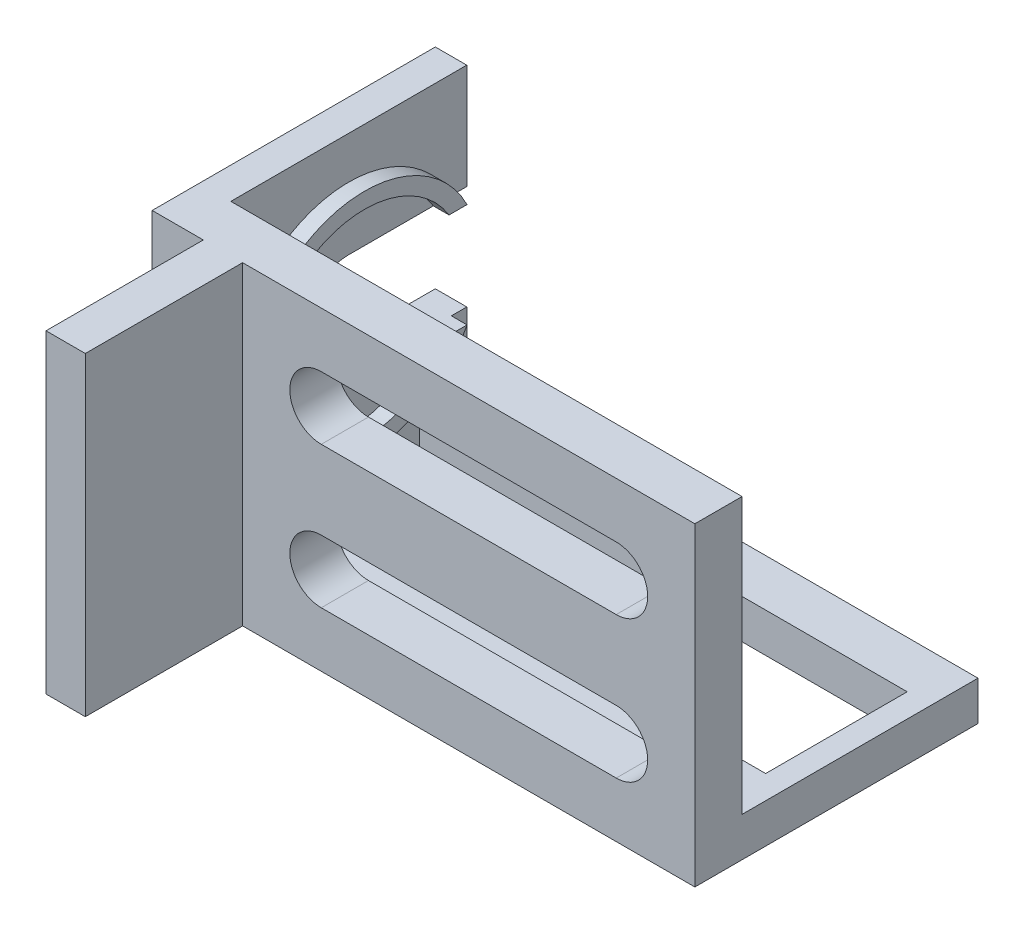
ISO-10303-21;
HEADER;
FILE_DESCRIPTION(('STEP AP214'),'2;1');
FILE_NAME('part.step','',(''),(''),'','','');
FILE_SCHEMA(('AUTOMOTIVE_DESIGN { 1 0 10303 214 1 1 1 1 }'));
ENDSEC;
DATA;
#1=APPLICATION_CONTEXT('core data for automotive mechanical design processes');
#2=APPLICATION_PROTOCOL_DEFINITION('international standard','automotive_design',2000,#1);
#3=PRODUCT_CONTEXT('',#1,'mechanical');
#4=PRODUCT('Part','Part','',(#3));
#5=PRODUCT_RELATED_PRODUCT_CATEGORY('part','',(#4));
#6=PRODUCT_DEFINITION_FORMATION('','',#4);
#7=PRODUCT_DEFINITION_CONTEXT('part definition',#1,'design');
#8=PRODUCT_DEFINITION('design','',#6,#7);
#9=PRODUCT_DEFINITION_SHAPE('','',#8);
#10=(LENGTH_UNIT() NAMED_UNIT(*) SI_UNIT(.MILLI.,.METRE.));
#11=(NAMED_UNIT(*) PLANE_ANGLE_UNIT() SI_UNIT($,.RADIAN.));
#12=(NAMED_UNIT(*) SI_UNIT($,.STERADIAN.) SOLID_ANGLE_UNIT());
#13=UNCERTAINTY_MEASURE_WITH_UNIT(LENGTH_MEASURE(1.E-05),#10,'distance_accuracy_value','');
#14=(GEOMETRIC_REPRESENTATION_CONTEXT(3) GLOBAL_UNCERTAINTY_ASSIGNED_CONTEXT((#13)) GLOBAL_UNIT_ASSIGNED_CONTEXT((#10,
#11,#12)) REPRESENTATION_CONTEXT('',''));
#15=CARTESIAN_POINT('',(0.,0.,0.));
#16=DIRECTION('',(0.,0.,1.));
#17=DIRECTION('',(1.,0.,0.));
#18=AXIS2_PLACEMENT_3D('',#15,#16,#17);
#19=CARTESIAN_POINT('',(40.3102496759067,-20.,-6.));
#20=DIRECTION('',(0.,0.,1.));
#21=DIRECTION('',(1.,0.,0.));
#22=AXIS2_PLACEMENT_3D('',#19,#20,#21);
#23=PLANE('',#22);
#24=DIRECTION('',(0.,-1.,0.));
#25=VECTOR('',#24,1.);
#26=CARTESIAN_POINT('',(29.5,-20.,-6.));
#27=LINE('',#26,#25);
#28=CARTESIAN_POINT('',(29.5,-15.,-6.));
#29=VERTEX_POINT('',#28);
#30=CARTESIAN_POINT('',(29.5,-20.,-6.));
#31=VERTEX_POINT('',#30);
#32=EDGE_CURVE('E857',#29,#31,#27,.T.);
#33=ORIENTED_EDGE('',*,*,#32,.T.);
#34=DIRECTION('',(-1.,0.,0.));
#35=VECTOR('',#34,1.);
#36=CARTESIAN_POINT('',(40.3102496759067,-20.,-6.));
#37=LINE('',#36,#35);
#38=CARTESIAN_POINT('',(-32.5,-20.,-6.));
#39=VERTEX_POINT('',#38);
#40=EDGE_CURVE('E886',#31,#39,#37,.T.);
#41=ORIENTED_EDGE('',*,*,#40,.T.);
#42=DIRECTION('',(0.,1.,0.));
#43=VECTOR('',#42,1.);
#44=CARTESIAN_POINT('',(-32.5,-20.,-6.));
#45=LINE('',#44,#43);
#46=CARTESIAN_POINT('',(-32.5,-15.,-6.));
#47=VERTEX_POINT('',#46);
#48=EDGE_CURVE('E873',#39,#47,#45,.T.);
#49=ORIENTED_EDGE('',*,*,#48,.T.);
#50=DIRECTION('',(-1.,0.,0.));
#51=VECTOR('',#50,1.);
#52=CARTESIAN_POINT('',(40.3102496759067,-15.,-6.));
#53=LINE('',#52,#51);
#54=EDGE_CURVE('E50',#29,#47,#53,.T.);
#55=ORIENTED_EDGE('',*,*,#54,.F.);
#56=EDGE_LOOP('',(#33,#41,#49,#55));
#57=FACE_BOUND('',#56,.T.);
#58=ADVANCED_FACE('F35',(#57),#23,.F.);
#59=CARTESIAN_POINT('',(40.3102496759067,-20.,-24.));
#60=DIRECTION('',(0.,0.,-1.));
#61=DIRECTION('',(-1.,0.,0.));
#62=AXIS2_PLACEMENT_3D('',#59,#60,#61);
#63=PLANE('',#62);
#64=DIRECTION('',(0.,-1.,0.));
#65=VECTOR('',#64,1.);
#66=CARTESIAN_POINT('',(29.5,-20.,-24.));
#67=LINE('',#66,#65);
#68=CARTESIAN_POINT('',(29.5,-15.,-24.));
#69=VERTEX_POINT('',#68);
#70=CARTESIAN_POINT('',(29.5,-20.,-24.));
#71=VERTEX_POINT('',#70);
#72=EDGE_CURVE('E866',#69,#71,#67,.T.);
#73=ORIENTED_EDGE('',*,*,#72,.F.);
#74=DIRECTION('',(-1.,0.,0.));
#75=VECTOR('',#74,1.);
#76=CARTESIAN_POINT('',(40.3102496759067,-15.,-24.));
#77=LINE('',#76,#75);
#78=CARTESIAN_POINT('',(-32.5,-15.,-24.));
#79=VERTEX_POINT('',#78);
#80=EDGE_CURVE('E865',#69,#79,#77,.T.);
#81=ORIENTED_EDGE('',*,*,#80,.T.);
#82=DIRECTION('',(0.,-1.,0.));
#83=VECTOR('',#82,1.);
#84=CARTESIAN_POINT('',(-32.5,-20.,-24.));
#85=LINE('',#84,#83);
#86=CARTESIAN_POINT('',(-32.5,-20.,-24.));
#87=VERTEX_POINT('',#86);
#88=EDGE_CURVE('E876',#79,#87,#85,.T.);
#89=ORIENTED_EDGE('',*,*,#88,.T.);
#90=DIRECTION('',(-1.,0.,0.));
#91=VECTOR('',#90,1.);
#92=CARTESIAN_POINT('',(40.3102496759067,-20.,-24.));
#93=LINE('',#92,#91);
#94=EDGE_CURVE('E58',#71,#87,#93,.T.);
#95=ORIENTED_EDGE('',*,*,#94,.F.);
#96=EDGE_LOOP('',(#73,#81,#89,#95));
#97=FACE_BOUND('',#96,.T.);
#98=ADVANCED_FACE('F506',(#97),#63,.F.);
#99=CARTESIAN_POINT('',(-32.5,0.,0.));
#100=DIRECTION('',(-1.,0.,0.));
#101=DIRECTION('',(0.,0.,1.));
#102=AXIS2_PLACEMENT_3D('',#99,#100,#101);
#103=PLANE('',#102);
#104=ORIENTED_EDGE('',*,*,#88,.F.);
#105=DIRECTION('',(0.,0.,1.));
#106=VECTOR('',#105,1.);
#107=CARTESIAN_POINT('',(-32.5,-15.,-30.));
#108=LINE('',#107,#106);
#109=CARTESIAN_POINT('',(-32.5,-15.,-30.));
#110=VERTEX_POINT('',#109);
#111=EDGE_CURVE('E861',#110,#79,#108,.T.);
#112=ORIENTED_EDGE('',*,*,#111,.F.);
#113=DIRECTION('',(0.,-1.,0.));
#114=VECTOR('',#113,1.);
#115=CARTESIAN_POINT('',(-32.5,20.,-30.));
#116=LINE('',#115,#114);
#117=CARTESIAN_POINT('',(-32.5,-6.62500000000001,-30.));
#118=VERTEX_POINT('',#117);
#119=EDGE_CURVE('E284',#118,#110,#116,.T.);
#120=ORIENTED_EDGE('',*,*,#119,.F.);
#121=DIRECTION('',(0.,0.,-1.));
#122=VECTOR('',#121,1.);
#123=CARTESIAN_POINT('',(-32.5,-6.62500000000001,-15.));
#124=LINE('',#123,#122);
#125=CARTESIAN_POINT('',(-32.5,-6.62500000000001,-28.0384048104053));
#126=VERTEX_POINT('',#125);
#127=EDGE_CURVE('E246',#126,#118,#124,.T.);
#128=ORIENTED_EDGE('',*,*,#127,.F.);
#129=CARTESIAN_POINT('',(-32.5,0.,-15.));
#130=DIRECTION('',(1.,0.,0.));
#131=DIRECTION('',(0.,0.,-1.));
#132=AXIS2_PLACEMENT_3D('',#129,#130,#131);
#133=CIRCLE('',#132,14.625);
#134=CARTESIAN_POINT('',(-32.5,6.62500000000001,-28.0384048104053));
#135=VERTEX_POINT('',#134);
#136=EDGE_CURVE('E387',#135,#126,#133,.T.);
#137=ORIENTED_EDGE('',*,*,#136,.F.);
#138=DIRECTION('',(0.,0.,1.));
#139=VECTOR('',#138,1.);
#140=CARTESIAN_POINT('',(-32.5,6.62500000000001,-30.));
#141=LINE('',#140,#139);
#142=CARTESIAN_POINT('',(-32.5,6.62500000000001,-30.));
#143=VERTEX_POINT('',#142);
#144=EDGE_CURVE('E411',#143,#135,#141,.T.);
#145=ORIENTED_EDGE('',*,*,#144,.F.);
#146=CARTESIAN_POINT('',(-32.5,20.,-30.));
#147=VERTEX_POINT('',#146);
#148=EDGE_CURVE('E286',#147,#143,#116,.T.);
#149=ORIENTED_EDGE('',*,*,#148,.F.);
#150=DIRECTION('',(0.,0.,-1.));
#151=VECTOR('',#150,1.);
#152=CARTESIAN_POINT('',(-32.5,20.,0.));
#153=LINE('',#152,#151);
#154=CARTESIAN_POINT('',(-32.5,20.,0.));
#155=VERTEX_POINT('',#154);
#156=EDGE_CURVE('E282',#155,#147,#153,.T.);
#157=ORIENTED_EDGE('',*,*,#156,.F.);
#158=DIRECTION('',(0.,-1.,0.));
#159=VECTOR('',#158,1.);
#160=CARTESIAN_POINT('',(-32.5,-20.,0.));
#161=LINE('',#160,#159);
#162=CARTESIAN_POINT('',(-32.5,-15.,0.));
#163=VERTEX_POINT('',#162);
#164=EDGE_CURVE('E295',#155,#163,#161,.T.);
#165=ORIENTED_EDGE('',*,*,#164,.T.);
#166=DIRECTION('',(0.,0.,1.));
#167=VECTOR('',#166,1.);
#168=CARTESIAN_POINT('',(-32.5,-15.,0.));
#169=LINE('',#168,#167);
#170=EDGE_CURVE('E882',#47,#163,#169,.T.);
#171=ORIENTED_EDGE('',*,*,#170,.F.);
#172=ORIENTED_EDGE('',*,*,#48,.F.);
#173=DIRECTION('',(0.,0.,1.));
#174=VECTOR('',#173,1.);
#175=CARTESIAN_POINT('',(-32.5,-20.,0.));
#176=LINE('',#175,#174);
#177=EDGE_CURVE('E274',#87,#39,#176,.T.);
#178=ORIENTED_EDGE('',*,*,#177,.F.);
#179=EDGE_LOOP('',(#104,#112,#120,#128,#137,#145,#149,#157,#165,#171,#172,#178));
#180=FACE_BOUND('',#179,.T.);
#181=ADVANCED_FACE('F474',(#180),#103,.F.);
#182=CARTESIAN_POINT('',(0.,0.,0.));
#183=DIRECTION('',(0.,0.,1.));
#184=DIRECTION('',(1.,0.,0.));
#185=AXIS2_PLACEMENT_3D('',#182,#183,#184);
#186=PLANE('',#185);
#187=DIRECTION('',(-1.,0.,0.));
#188=VECTOR('',#187,1.);
#189=CARTESIAN_POINT('',(0.,-5.00000000000001,0.));
#190=LINE('',#189,#188);
#191=CARTESIAN_POINT('',(22.5,-5.,0.));
#192=VERTEX_POINT('',#191);
#193=CARTESIAN_POINT('',(-15.,-5.00000000000001,0.));
#194=VERTEX_POINT('',#193);
#195=EDGE_CURVE('E321',#192,#194,#190,.T.);
#196=ORIENTED_EDGE('',*,*,#195,.T.);
#197=CARTESIAN_POINT('',(-15.,-9.00000000000001,0.));
#198=DIRECTION('',(0.,0.,1.));
#199=DIRECTION('',(1.,0.,0.));
#200=AXIS2_PLACEMENT_3D('',#197,#198,#199);
#201=CIRCLE('',#200,4.);
#202=CARTESIAN_POINT('',(-15.,-13.,0.));
#203=VERTEX_POINT('',#202);
#204=EDGE_CURVE('E324',#194,#203,#201,.T.);
#205=ORIENTED_EDGE('',*,*,#204,.T.);
#206=DIRECTION('',(1.,0.,0.));
#207=VECTOR('',#206,1.);
#208=CARTESIAN_POINT('',(0.,-13.,0.));
#209=LINE('',#208,#207);
#210=CARTESIAN_POINT('',(22.5,-13.,0.));
#211=VERTEX_POINT('',#210);
#212=EDGE_CURVE('E315',#203,#211,#209,.T.);
#213=ORIENTED_EDGE('',*,*,#212,.T.);
#214=CARTESIAN_POINT('',(22.5,-9.,0.));
#215=DIRECTION('',(0.,0.,1.));
#216=DIRECTION('',(1.,0.,0.));
#217=AXIS2_PLACEMENT_3D('',#214,#215,#216);
#218=CIRCLE('',#217,4.);
#219=EDGE_CURVE('E318',#211,#192,#218,.T.);
#220=ORIENTED_EDGE('',*,*,#219,.T.);
#221=EDGE_LOOP('',(#196,#205,#213,#220));
#222=FACE_BOUND('',#221,.T.);
#223=DIRECTION('',(-1.,0.,0.));
#224=VECTOR('',#223,1.);
#225=CARTESIAN_POINT('',(0.,13.,0.));
#226=LINE('',#225,#224);
#227=CARTESIAN_POINT('',(22.5,13.,0.));
#228=VERTEX_POINT('',#227);
#229=CARTESIAN_POINT('',(-15.,13.,0.));
#230=VERTEX_POINT('',#229);
#231=EDGE_CURVE('E43',#228,#230,#226,.T.);
#232=ORIENTED_EDGE('',*,*,#231,.T.);
#233=CARTESIAN_POINT('',(-15.,8.99999999999999,0.));
#234=DIRECTION('',(0.,0.,1.));
#235=DIRECTION('',(1.,0.,0.));
#236=AXIS2_PLACEMENT_3D('',#233,#234,#235);
#237=CIRCLE('',#236,4.);
#238=CARTESIAN_POINT('',(-15.,4.99999999999999,0.));
#239=VERTEX_POINT('',#238);
#240=EDGE_CURVE('E11',#230,#239,#237,.T.);
#241=ORIENTED_EDGE('',*,*,#240,.T.);
#242=DIRECTION('',(1.,0.,0.));
#243=VECTOR('',#242,1.);
#244=CARTESIAN_POINT('',(0.,4.99999999999999,0.));
#245=LINE('',#244,#243);
#246=CARTESIAN_POINT('',(22.5,5.,0.));
#247=VERTEX_POINT('',#246);
#248=EDGE_CURVE('E327',#239,#247,#245,.T.);
#249=ORIENTED_EDGE('',*,*,#248,.T.);
#250=CARTESIAN_POINT('',(22.5,8.99999999999999,0.));
#251=DIRECTION('',(0.,0.,1.));
#252=DIRECTION('',(1.,0.,0.));
#253=AXIS2_PLACEMENT_3D('',#250,#251,#252);
#254=CIRCLE('',#253,4.);
#255=EDGE_CURVE('E330',#247,#228,#254,.T.);
#256=ORIENTED_EDGE('',*,*,#255,.T.);
#257=EDGE_LOOP('',(#232,#241,#249,#256));
#258=FACE_BOUND('',#257,.T.);
#259=DIRECTION('',(-1.,0.,0.));
#260=VECTOR('',#259,1.);
#261=CARTESIAN_POINT('',(40.3102496759067,-15.,0.));
#262=LINE('',#261,#260);
#263=CARTESIAN_POINT('',(32.5,-15.,0.));
#264=VERTEX_POINT('',#263);
#265=EDGE_CURVE('E469',#264,#163,#262,.T.);
#266=ORIENTED_EDGE('',*,*,#265,.T.);
#267=ORIENTED_EDGE('',*,*,#164,.F.);
#268=DIRECTION('',(-1.,0.,0.));
#269=VECTOR('',#268,1.);
#270=CARTESIAN_POINT('',(32.5,20.,0.));
#271=LINE('',#270,#269);
#272=CARTESIAN_POINT('',(32.5,20.,0.));
#273=VERTEX_POINT('',#272);
#274=EDGE_CURVE('E309',#273,#155,#271,.T.);
#275=ORIENTED_EDGE('',*,*,#274,.F.);
#276=DIRECTION('',(0.,1.,0.));
#277=VECTOR('',#276,1.);
#278=CARTESIAN_POINT('',(32.5,-20.,0.));
#279=LINE('',#278,#277);
#280=EDGE_CURVE('E307',#264,#273,#279,.T.);
#281=ORIENTED_EDGE('',*,*,#280,.F.);
#282=EDGE_LOOP('',(#266,#267,#275,#281));
#283=FACE_BOUND('',#282,.T.);
#284=ADVANCED_FACE('F334',(#222,#258,#283),#186,.F.);
#285=CARTESIAN_POINT('',(-32.5,0.,-15.));
#286=DIRECTION('',(-1.,0.,0.));
#287=DIRECTION('',(0.,0.,-1.));
#288=AXIS2_PLACEMENT_3D('',#285,#286,#287);
#289=CIRCLE('',#288,12.625);
#290=CARTESIAN_POINT('',(-32.5,-6.62500000000001,-25.7470926301023));
#291=VERTEX_POINT('',#290);
#292=CARTESIAN_POINT('',(-32.5,6.62500000000001,-25.7470926301023));
#293=VERTEX_POINT('',#292);
#294=EDGE_CURVE('E352',#291,#293,#289,.T.);
#295=ORIENTED_EDGE('',*,*,#294,.F.);
#296=CARTESIAN_POINT('',(-32.5,-6.62500000000001,-15.));
#297=VERTEX_POINT('',#296);
#298=EDGE_CURVE('E408',#297,#291,#124,.T.);
#299=ORIENTED_EDGE('',*,*,#298,.F.);
#300=CARTESIAN_POINT('',(-32.5,0.,-15.));
#301=DIRECTION('',(1.,0.,0.));
#302=DIRECTION('',(0.,0.,-1.));
#303=AXIS2_PLACEMENT_3D('',#300,#301,#302);
#304=CIRCLE('',#303,6.62500000000001);
#305=CARTESIAN_POINT('',(-32.5,6.62500000000001,-15.));
#306=VERTEX_POINT('',#305);
#307=EDGE_CURVE('E405',#306,#297,#304,.T.);
#308=ORIENTED_EDGE('',*,*,#307,.F.);
#309=EDGE_CURVE('E410',#293,#306,#141,.T.);
#310=ORIENTED_EDGE('',*,*,#309,.F.);
#311=EDGE_LOOP('',(#295,#299,#308,#310));
#312=FACE_BOUND('',#311,.T.);
#313=ADVANCED_FACE('F503',(#312),#103,.F.);
#314=CARTESIAN_POINT('',(0.,0.,6.));
#315=DIRECTION('',(0.,0.,1.));
#316=DIRECTION('',(1.,0.,0.));
#317=AXIS2_PLACEMENT_3D('',#314,#315,#316);
#318=PLANE('',#317);
#319=CARTESIAN_POINT('',(-15.,8.99999999999999,6.));
#320=DIRECTION('',(0.,0.,1.));
#321=DIRECTION('',(1.,0.,0.));
#322=AXIS2_PLACEMENT_3D('',#319,#320,#321);
#323=CIRCLE('',#322,4.);
#324=CARTESIAN_POINT('',(-15.,13.,6.));
#325=VERTEX_POINT('',#324);
#326=CARTESIAN_POINT('',(-15.,4.99999999999999,6.));
#327=VERTEX_POINT('',#326);
#328=EDGE_CURVE('E376',#325,#327,#323,.T.);
#329=ORIENTED_EDGE('',*,*,#328,.F.);
#330=DIRECTION('',(-1.,0.,0.));
#331=VECTOR('',#330,1.);
#332=CARTESIAN_POINT('',(-15.,13.,6.));
#333=LINE('',#332,#331);
#334=CARTESIAN_POINT('',(22.5,13.,6.));
#335=VERTEX_POINT('',#334);
#336=EDGE_CURVE('E360',#335,#325,#333,.T.);
#337=ORIENTED_EDGE('',*,*,#336,.F.);
#338=CARTESIAN_POINT('',(22.5,8.99999999999999,6.));
#339=DIRECTION('',(0.,0.,1.));
#340=DIRECTION('',(1.,0.,0.));
#341=AXIS2_PLACEMENT_3D('',#338,#339,#340);
#342=CIRCLE('',#341,4.);
#343=CARTESIAN_POINT('',(22.5,4.99999999999999,6.));
#344=VERTEX_POINT('',#343);
#345=EDGE_CURVE('E348',#344,#335,#342,.T.);
#346=ORIENTED_EDGE('',*,*,#345,.F.);
#347=DIRECTION('',(1.,0.,0.));
#348=VECTOR('',#347,1.);
#349=CARTESIAN_POINT('',(-15.,4.99999999999999,6.));
#350=LINE('',#349,#348);
#351=EDGE_CURVE('E890',#327,#344,#350,.T.);
#352=ORIENTED_EDGE('',*,*,#351,.F.);
#353=EDGE_LOOP('',(#329,#337,#346,#352));
#354=FACE_BOUND('',#353,.T.);
#355=CARTESIAN_POINT('',(-15.,-9.00000000000001,6.));
#356=DIRECTION('',(0.,0.,1.));
#357=DIRECTION('',(1.,0.,0.));
#358=AXIS2_PLACEMENT_3D('',#355,#356,#357);
#359=CIRCLE('',#358,4.);
#360=CARTESIAN_POINT('',(-15.,-5.00000000000001,6.));
#361=VERTEX_POINT('',#360);
#362=CARTESIAN_POINT('',(-15.,-13.,6.));
#363=VERTEX_POINT('',#362);
#364=EDGE_CURVE('E361',#361,#363,#359,.T.);
#365=ORIENTED_EDGE('',*,*,#364,.F.);
#366=DIRECTION('',(-1.,0.,0.));
#367=VECTOR('',#366,1.);
#368=CARTESIAN_POINT('',(-15.,-5.00000000000001,6.));
#369=LINE('',#368,#367);
#370=CARTESIAN_POINT('',(22.5,-5.,6.));
#371=VERTEX_POINT('',#370);
#372=EDGE_CURVE('E370',#371,#361,#369,.T.);
#373=ORIENTED_EDGE('',*,*,#372,.F.);
#374=CARTESIAN_POINT('',(22.5,-9.,6.));
#375=DIRECTION('',(0.,0.,1.));
#376=DIRECTION('',(1.,0.,0.));
#377=AXIS2_PLACEMENT_3D('',#374,#375,#376);
#378=CIRCLE('',#377,4.);
#379=CARTESIAN_POINT('',(22.5,-13.,6.));
#380=VERTEX_POINT('',#379);
#381=EDGE_CURVE('E367',#380,#371,#378,.T.);
#382=ORIENTED_EDGE('',*,*,#381,.F.);
#383=DIRECTION('',(1.,0.,0.));
#384=VECTOR('',#383,1.);
#385=CARTESIAN_POINT('',(-15.,-13.,6.));
#386=LINE('',#385,#384);
#387=EDGE_CURVE('E363',#363,#380,#386,.T.);
#388=ORIENTED_EDGE('',*,*,#387,.F.);
#389=EDGE_LOOP('',(#365,#373,#382,#388));
#390=FACE_BOUND('',#389,.T.);
#391=DIRECTION('',(-1.,0.,0.));
#392=VECTOR('',#391,1.);
#393=CARTESIAN_POINT('',(32.5,20.,6.));
#394=LINE('',#393,#392);
#395=CARTESIAN_POINT('',(32.5,20.,6.));
#396=VERTEX_POINT('',#395);
#397=CARTESIAN_POINT('',(-25.,20.,6.));
#398=VERTEX_POINT('',#397);
#399=EDGE_CURVE('E302',#396,#398,#394,.T.);
#400=ORIENTED_EDGE('',*,*,#399,.T.);
#401=DIRECTION('',(0.,-1.,0.));
#402=VECTOR('',#401,1.);
#403=CARTESIAN_POINT('',(-25.,0.,6.));
#404=LINE('',#403,#402);
#405=CARTESIAN_POINT('',(-25.,-20.,6.));
#406=VERTEX_POINT('',#405);
#407=EDGE_CURVE('E417',#398,#406,#404,.T.);
#408=ORIENTED_EDGE('',*,*,#407,.T.);
#409=DIRECTION('',(1.,0.,0.));
#410=VECTOR('',#409,1.);
#411=CARTESIAN_POINT('',(32.5,-20.,6.));
#412=LINE('',#411,#410);
#413=CARTESIAN_POINT('',(32.5,-20.,6.));
#414=VERTEX_POINT('',#413);
#415=EDGE_CURVE('E299',#406,#414,#412,.T.);
#416=ORIENTED_EDGE('',*,*,#415,.T.);
#417=DIRECTION('',(0.,1.,0.));
#418=VECTOR('',#417,1.);
#419=CARTESIAN_POINT('',(32.5,-20.,6.));
#420=LINE('',#419,#418);
#421=EDGE_CURVE('E298',#414,#396,#420,.T.);
#422=ORIENTED_EDGE('',*,*,#421,.T.);
#423=EDGE_LOOP('',(#400,#408,#416,#422));
#424=FACE_BOUND('',#423,.T.);
#425=ADVANCED_FACE('F454',(#354,#390,#424),#318,.T.);
#426=CARTESIAN_POINT('',(-36.5,20.,-30.));
#427=DIRECTION('',(0.,0.,1.));
#428=DIRECTION('',(0.,-1.,0.));
#429=AXIS2_PLACEMENT_3D('',#426,#427,#428);
#430=PLANE('',#429);
#431=DIRECTION('',(0.,-1.,0.));
#432=VECTOR('',#431,1.);
#433=CARTESIAN_POINT('',(-36.5,20.,-30.));
#434=LINE('',#433,#432);
#435=CARTESIAN_POINT('',(-36.5,-6.62500000000001,-30.));
#436=VERTEX_POINT('',#435);
#437=CARTESIAN_POINT('',(-36.5,-20.,-30.));
#438=VERTEX_POINT('',#437);
#439=EDGE_CURVE('E258',#436,#438,#434,.T.);
#440=ORIENTED_EDGE('',*,*,#439,.F.);
#441=DIRECTION('',(1.,0.,0.));
#442=VECTOR('',#441,1.);
#443=CARTESIAN_POINT('',(-33.7,-6.62500000000001,-30.));
#444=LINE('',#443,#442);
#445=EDGE_CURVE('E239',#436,#118,#444,.T.);
#446=ORIENTED_EDGE('',*,*,#445,.T.);
#447=ORIENTED_EDGE('',*,*,#119,.T.);
#448=DIRECTION('',(-1.,0.,0.));
#449=VECTOR('',#448,1.);
#450=CARTESIAN_POINT('',(40.3102496759067,-15.,-30.));
#451=LINE('',#450,#449);
#452=CARTESIAN_POINT('',(32.5,-15.,-30.));
#453=VERTEX_POINT('',#452);
#454=EDGE_CURVE('E874',#453,#110,#451,.T.);
#455=ORIENTED_EDGE('',*,*,#454,.F.);
#456=DIRECTION('',(0.,-1.,0.));
#457=VECTOR('',#456,1.);
#458=CARTESIAN_POINT('',(32.5,-20.,-30.));
#459=LINE('',#458,#457);
#460=CARTESIAN_POINT('',(32.5,-20.,-30.));
#461=VERTEX_POINT('',#460);
#462=EDGE_CURVE('E871',#453,#461,#459,.T.);
#463=ORIENTED_EDGE('',*,*,#462,.T.);
#464=DIRECTION('',(1.,0.,0.));
#465=VECTOR('',#464,1.);
#466=CARTESIAN_POINT('',(-36.5,-20.,-30.));
#467=LINE('',#466,#465);
#468=EDGE_CURVE('E267',#438,#461,#467,.T.);
#469=ORIENTED_EDGE('',*,*,#468,.F.);
#470=EDGE_LOOP('',(#440,#446,#447,#455,#463,#469));
#471=FACE_BOUND('',#470,.T.);
#472=ADVANCED_FACE('F264',(#471),#430,.F.);
#473=CARTESIAN_POINT('',(32.5,-20.,6.));
#474=DIRECTION('',(0.,1.,0.));
#475=DIRECTION('',(-1.,0.,0.));
#476=AXIS2_PLACEMENT_3D('',#473,#474,#475);
#477=PLANE('',#476);
#478=ORIENTED_EDGE('',*,*,#40,.F.);
#479=DIRECTION('',(0.,0.,-1.));
#480=VECTOR('',#479,1.);
#481=CARTESIAN_POINT('',(29.5,-20.,-0.169048105154695));
#482=LINE('',#481,#480);
#483=EDGE_CURVE('E860',#31,#71,#482,.T.);
#484=ORIENTED_EDGE('',*,*,#483,.T.);
#485=ORIENTED_EDGE('',*,*,#94,.T.);
#486=ORIENTED_EDGE('',*,*,#177,.T.);
#487=EDGE_LOOP('',(#478,#484,#485,#486));
#488=FACE_BOUND('',#487,.T.);
#489=ORIENTED_EDGE('',*,*,#468,.T.);
#490=DIRECTION('',(0.,0.,-1.));
#491=VECTOR('',#490,1.);
#492=CARTESIAN_POINT('',(32.5,-20.,6.));
#493=LINE('',#492,#491);
#494=EDGE_CURVE('E313',#414,#461,#493,.T.);
#495=ORIENTED_EDGE('',*,*,#494,.F.);
#496=ORIENTED_EDGE('',*,*,#415,.F.);
#497=DIRECTION('',(0.,0.,-1.));
#498=VECTOR('',#497,1.);
#499=CARTESIAN_POINT('',(-25.,-20.,26.));
#500=LINE('',#499,#498);
#501=CARTESIAN_POINT('',(-25.,-20.,26.));
#502=VERTEX_POINT('',#501);
#503=EDGE_CURVE('E430',#502,#406,#500,.T.);
#504=ORIENTED_EDGE('',*,*,#503,.F.);
#505=DIRECTION('',(1.,0.,0.));
#506=VECTOR('',#505,1.);
#507=CARTESIAN_POINT('',(0.,-20.,26.));
#508=LINE('',#507,#506);
#509=CARTESIAN_POINT('',(-30.,-20.,26.));
#510=VERTEX_POINT('',#509);
#511=EDGE_CURVE('E428',#510,#502,#508,.T.);
#512=ORIENTED_EDGE('',*,*,#511,.F.);
#513=DIRECTION('',(0.,0.,-1.));
#514=VECTOR('',#513,1.);
#515=CARTESIAN_POINT('',(-30.,-20.,26.));
#516=LINE('',#515,#514);
#517=CARTESIAN_POINT('',(-30.,-20.,6.));
#518=VERTEX_POINT('',#517);
#519=EDGE_CURVE('E436',#510,#518,#516,.T.);
#520=ORIENTED_EDGE('',*,*,#519,.T.);
#521=CARTESIAN_POINT('',(-36.5,-20.,6.));
#522=VERTEX_POINT('',#521);
#523=EDGE_CURVE('E296',#522,#518,#412,.T.);
#524=ORIENTED_EDGE('',*,*,#523,.F.);
#525=DIRECTION('',(0.,0.,1.));
#526=VECTOR('',#525,1.);
#527=CARTESIAN_POINT('',(-36.5,-20.,-30.));
#528=LINE('',#527,#526);
#529=EDGE_CURVE('E273',#438,#522,#528,.T.);
#530=ORIENTED_EDGE('',*,*,#529,.F.);
#531=EDGE_LOOP('',(#489,#495,#496,#504,#512,#520,#524,#530));
#532=FACE_BOUND('',#531,.T.);
#533=ADVANCED_FACE('F37',(#488,#532),#477,.F.);
#534=CARTESIAN_POINT('',(32.5,-20.,6.));
#535=DIRECTION('',(-1.,0.,0.));
#536=DIRECTION('',(0.,0.,1.));
#537=AXIS2_PLACEMENT_3D('',#534,#535,#536);
#538=PLANE('',#537);
#539=ORIENTED_EDGE('',*,*,#494,.T.);
#540=ORIENTED_EDGE('',*,*,#462,.F.);
#541=DIRECTION('',(0.,0.,-1.));
#542=VECTOR('',#541,1.);
#543=CARTESIAN_POINT('',(32.5,-15.,0.));
#544=LINE('',#543,#542);
#545=EDGE_CURVE('E364',#264,#453,#544,.T.);
#546=ORIENTED_EDGE('',*,*,#545,.F.);
#547=ORIENTED_EDGE('',*,*,#280,.T.);
#548=DIRECTION('',(0.,0.,-1.));
#549=VECTOR('',#548,1.);
#550=CARTESIAN_POINT('',(32.5,20.,6.));
#551=LINE('',#550,#549);
#552=EDGE_CURVE('E304',#396,#273,#551,.T.);
#553=ORIENTED_EDGE('',*,*,#552,.F.);
#554=ORIENTED_EDGE('',*,*,#421,.F.);
#555=EDGE_LOOP('',(#539,#540,#546,#547,#553,#554));
#556=FACE_BOUND('',#555,.T.);
#557=ADVANCED_FACE('F462',(#556),#538,.F.);
#558=CARTESIAN_POINT('',(32.5,20.,6.));
#559=DIRECTION('',(0.,-1.,0.));
#560=DIRECTION('',(1.,0.,0.));
#561=AXIS2_PLACEMENT_3D('',#558,#559,#560);
#562=PLANE('',#561);
#563=ORIENTED_EDGE('',*,*,#274,.T.);
#564=ORIENTED_EDGE('',*,*,#156,.T.);
#565=DIRECTION('',(1.,0.,0.));
#566=VECTOR('',#565,1.);
#567=CARTESIAN_POINT('',(-36.5,20.,-30.));
#568=LINE('',#567,#566);
#569=CARTESIAN_POINT('',(-36.5,20.,-30.));
#570=VERTEX_POINT('',#569);
#571=EDGE_CURVE('E292',#570,#147,#568,.T.);
#572=ORIENTED_EDGE('',*,*,#571,.F.);
#573=DIRECTION('',(0.,0.,-1.));
#574=VECTOR('',#573,1.);
#575=CARTESIAN_POINT('',(-36.5,20.,6.));
#576=LINE('',#575,#574);
#577=CARTESIAN_POINT('',(-36.5,20.,6.));
#578=VERTEX_POINT('',#577);
#579=EDGE_CURVE('E270',#578,#570,#576,.T.);
#580=ORIENTED_EDGE('',*,*,#579,.F.);
#581=CARTESIAN_POINT('',(-30.,20.,6.));
#582=VERTEX_POINT('',#581);
#583=EDGE_CURVE('E301',#582,#578,#394,.T.);
#584=ORIENTED_EDGE('',*,*,#583,.F.);
#585=DIRECTION('',(0.,0.,-1.));
#586=VECTOR('',#585,1.);
#587=CARTESIAN_POINT('',(-30.,20.,26.));
#588=LINE('',#587,#586);
#589=CARTESIAN_POINT('',(-30.,20.,26.));
#590=VERTEX_POINT('',#589);
#591=EDGE_CURVE('E439',#590,#582,#588,.T.);
#592=ORIENTED_EDGE('',*,*,#591,.F.);
#593=DIRECTION('',(-1.,0.,0.));
#594=VECTOR('',#593,1.);
#595=CARTESIAN_POINT('',(0.,20.,26.));
#596=LINE('',#595,#594);
#597=CARTESIAN_POINT('',(-25.,20.,26.));
#598=VERTEX_POINT('',#597);
#599=EDGE_CURVE('E423',#598,#590,#596,.T.);
#600=ORIENTED_EDGE('',*,*,#599,.F.);
#601=DIRECTION('',(0.,0.,-1.));
#602=VECTOR('',#601,1.);
#603=CARTESIAN_POINT('',(-25.,20.,26.));
#604=LINE('',#603,#602);
#605=EDGE_CURVE('E285',#598,#398,#604,.T.);
#606=ORIENTED_EDGE('',*,*,#605,.T.);
#607=ORIENTED_EDGE('',*,*,#399,.F.);
#608=ORIENTED_EDGE('',*,*,#552,.T.);
#609=EDGE_LOOP('',(#563,#564,#572,#580,#584,#592,#600,#606,#607,#608));
#610=FACE_BOUND('',#609,.T.);
#611=ADVANCED_FACE('F446',(#610),#562,.F.);
#612=DIRECTION('',(0.,-1.,0.));
#613=VECTOR('',#612,1.);
#614=CARTESIAN_POINT('',(-30.,0.,6.));
#615=LINE('',#614,#613);
#616=EDGE_CURVE('E424',#582,#518,#615,.T.);
#617=ORIENTED_EDGE('',*,*,#616,.F.);
#618=ORIENTED_EDGE('',*,*,#583,.T.);
#619=DIRECTION('',(0.,1.,0.));
#620=VECTOR('',#619,1.);
#621=CARTESIAN_POINT('',(-36.5,-20.,6.));
#622=LINE('',#621,#620);
#623=EDGE_CURVE('E279',#522,#578,#622,.T.);
#624=ORIENTED_EDGE('',*,*,#623,.F.);
#625=ORIENTED_EDGE('',*,*,#523,.T.);
#626=EDGE_LOOP('',(#617,#618,#624,#625));
#627=FACE_BOUND('',#626,.T.);
#628=ADVANCED_FACE('F492',(#627),#318,.T.);
#629=DIRECTION('',(1.,0.,0.));
#630=VECTOR('',#629,1.);
#631=CARTESIAN_POINT('',(-33.7,6.62500000000001,-30.));
#632=LINE('',#631,#630);
#633=CARTESIAN_POINT('',(-36.5,6.62500000000001,-30.));
#634=VERTEX_POINT('',#633);
#635=EDGE_CURVE('E251',#634,#143,#632,.T.);
#636=ORIENTED_EDGE('',*,*,#635,.F.);
#637=EDGE_CURVE('E269',#570,#634,#434,.T.);
#638=ORIENTED_EDGE('',*,*,#637,.F.);
#639=ORIENTED_EDGE('',*,*,#571,.T.);
#640=ORIENTED_EDGE('',*,*,#148,.T.);
#641=EDGE_LOOP('',(#636,#638,#639,#640));
#642=FACE_BOUND('',#641,.T.);
#643=ADVANCED_FACE('F480',(#642),#430,.F.);
#644=CARTESIAN_POINT('',(-36.5,0.,0.));
#645=DIRECTION('',(-1.,0.,0.));
#646=DIRECTION('',(0.,0.,1.));
#647=AXIS2_PLACEMENT_3D('',#644,#645,#646);
#648=PLANE('',#647);
#649=DIRECTION('',(0.,0.,1.));
#650=VECTOR('',#649,1.);
#651=CARTESIAN_POINT('',(-36.5,6.62500000000001,-30.));
#652=LINE('',#651,#650);
#653=CARTESIAN_POINT('',(-36.5,6.62500000000001,-15.));
#654=VERTEX_POINT('',#653);
#655=EDGE_CURVE('E482',#634,#654,#652,.T.);
#656=ORIENTED_EDGE('',*,*,#655,.T.);
#657=CARTESIAN_POINT('',(-36.5,0.,-15.));
#658=DIRECTION('',(-1.,0.,0.));
#659=DIRECTION('',(0.,0.,1.));
#660=AXIS2_PLACEMENT_3D('',#657,#658,#659);
#661=CIRCLE('',#660,6.62500000000001);
#662=CARTESIAN_POINT('',(-36.5,-6.62500000000002,-15.));
#663=VERTEX_POINT('',#662);
#664=EDGE_CURVE('E261',#654,#663,#661,.F.);
#665=ORIENTED_EDGE('',*,*,#664,.T.);
#666=DIRECTION('',(0.,0.,-1.));
#667=VECTOR('',#666,1.);
#668=CARTESIAN_POINT('',(-36.5,-6.62500000000001,-15.));
#669=LINE('',#668,#667);
#670=EDGE_CURVE('E243',#663,#436,#669,.T.);
#671=ORIENTED_EDGE('',*,*,#670,.T.);
#672=ORIENTED_EDGE('',*,*,#439,.T.);
#673=ORIENTED_EDGE('',*,*,#529,.T.);
#674=ORIENTED_EDGE('',*,*,#623,.T.);
#675=ORIENTED_EDGE('',*,*,#579,.T.);
#676=ORIENTED_EDGE('',*,*,#637,.T.);
#677=EDGE_LOOP('',(#656,#665,#671,#672,#673,#674,#675,#676));
#678=FACE_BOUND('',#677,.T.);
#679=ADVANCED_FACE('F256',(#678),#648,.T.);
#680=CARTESIAN_POINT('',(-25.,0.,26.));
#681=DIRECTION('',(1.,0.,0.));
#682=DIRECTION('',(0.,1.,0.));
#683=AXIS2_PLACEMENT_3D('',#680,#681,#682);
#684=PLANE('',#683);
#685=ORIENTED_EDGE('',*,*,#407,.F.);
#686=ORIENTED_EDGE('',*,*,#605,.F.);
#687=DIRECTION('',(0.,-1.,0.));
#688=VECTOR('',#687,1.);
#689=CARTESIAN_POINT('',(-25.,0.,26.));
#690=LINE('',#689,#688);
#691=EDGE_CURVE('E420',#598,#502,#690,.T.);
#692=ORIENTED_EDGE('',*,*,#691,.T.);
#693=ORIENTED_EDGE('',*,*,#503,.T.);
#694=EDGE_LOOP('',(#685,#686,#692,#693));
#695=FACE_BOUND('',#694,.T.);
#696=ADVANCED_FACE('F450',(#695),#684,.T.);
#697=CARTESIAN_POINT('',(-30.,0.,26.));
#698=DIRECTION('',(1.,0.,0.));
#699=DIRECTION('',(0.,1.,0.));
#700=AXIS2_PLACEMENT_3D('',#697,#698,#699);
#701=PLANE('',#700);
#702=ORIENTED_EDGE('',*,*,#616,.T.);
#703=ORIENTED_EDGE('',*,*,#519,.F.);
#704=DIRECTION('',(0.,-1.,0.));
#705=VECTOR('',#704,1.);
#706=CARTESIAN_POINT('',(-30.,0.,26.));
#707=LINE('',#706,#705);
#708=EDGE_CURVE('E426',#590,#510,#707,.T.);
#709=ORIENTED_EDGE('',*,*,#708,.F.);
#710=ORIENTED_EDGE('',*,*,#591,.T.);
#711=EDGE_LOOP('',(#702,#703,#709,#710));
#712=FACE_BOUND('',#711,.T.);
#713=ADVANCED_FACE('F488',(#712),#701,.F.);
#714=CARTESIAN_POINT('',(0.,0.,26.));
#715=DIRECTION('',(0.,0.,1.));
#716=DIRECTION('',(1.,0.,0.));
#717=AXIS2_PLACEMENT_3D('',#714,#715,#716);
#718=PLANE('',#717);
#719=ORIENTED_EDGE('',*,*,#691,.F.);
#720=ORIENTED_EDGE('',*,*,#599,.T.);
#721=ORIENTED_EDGE('',*,*,#708,.T.);
#722=ORIENTED_EDGE('',*,*,#511,.T.);
#723=EDGE_LOOP('',(#719,#720,#721,#722));
#724=FACE_BOUND('',#723,.T.);
#725=ADVANCED_FACE('F491',(#724),#718,.T.);
#726=CARTESIAN_POINT('',(-33.7,0.,-15.));
#727=DIRECTION('',(1.,0.,0.));
#728=DIRECTION('',(0.,0.,-1.));
#729=AXIS2_PLACEMENT_3D('',#726,#727,#728);
#730=CYLINDRICAL_SURFACE('',#729,6.62500000000001);
#731=ORIENTED_EDGE('',*,*,#307,.T.);
#732=DIRECTION('',(1.,0.,0.));
#733=VECTOR('',#732,1.);
#734=CARTESIAN_POINT('',(-33.7,-6.62500000000001,-15.));
#735=LINE('',#734,#733);
#736=EDGE_CURVE('E252',#663,#297,#735,.T.);
#737=ORIENTED_EDGE('',*,*,#736,.F.);
#738=ORIENTED_EDGE('',*,*,#664,.F.);
#739=DIRECTION('',(1.,0.,0.));
#740=VECTOR('',#739,1.);
#741=CARTESIAN_POINT('',(-33.7,6.62500000000001,-15.));
#742=LINE('',#741,#740);
#743=EDGE_CURVE('E414',#654,#306,#742,.T.);
#744=ORIENTED_EDGE('',*,*,#743,.T.);
#745=EDGE_LOOP('',(#731,#737,#738,#744));
#746=FACE_BOUND('',#745,.T.);
#747=ADVANCED_FACE('F558',(#746),#730,.F.);
#748=CARTESIAN_POINT('',(-33.7,6.62500000000001,-30.));
#749=DIRECTION('',(0.,1.,0.));
#750=DIRECTION('',(0.,0.,1.));
#751=AXIS2_PLACEMENT_3D('',#748,#749,#750);
#752=PLANE('',#751);
#753=ORIENTED_EDGE('',*,*,#144,.T.);
#754=DIRECTION('',(-1.,0.,0.));
#755=VECTOR('',#754,1.);
#756=CARTESIAN_POINT('',(-30.5,6.62500000000001,-28.0384048104053));
#757=LINE('',#756,#755);
#758=CARTESIAN_POINT('',(-30.5,6.62500000000001,-28.0384048104053));
#759=VERTEX_POINT('',#758);
#760=EDGE_CURVE('E401',#759,#135,#757,.T.);
#761=ORIENTED_EDGE('',*,*,#760,.F.);
#762=DIRECTION('',(0.,0.,-1.));
#763=VECTOR('',#762,1.);
#764=CARTESIAN_POINT('',(-30.5,6.62500000000001,-28.0384048104053));
#765=LINE('',#764,#763);
#766=CARTESIAN_POINT('',(-30.5,6.62500000000001,-25.7470926301023));
#767=VERTEX_POINT('',#766);
#768=EDGE_CURVE('E386',#767,#759,#765,.T.);
#769=ORIENTED_EDGE('',*,*,#768,.F.);
#770=DIRECTION('',(-1.,0.,0.));
#771=VECTOR('',#770,1.);
#772=CARTESIAN_POINT('',(-30.5,6.62500000000001,-25.7470926301023));
#773=LINE('',#772,#771);
#774=EDGE_CURVE('E403',#767,#293,#773,.T.);
#775=ORIENTED_EDGE('',*,*,#774,.T.);
#776=ORIENTED_EDGE('',*,*,#309,.T.);
#777=ORIENTED_EDGE('',*,*,#743,.F.);
#778=ORIENTED_EDGE('',*,*,#655,.F.);
#779=ORIENTED_EDGE('',*,*,#635,.T.);
#780=EDGE_LOOP('',(#753,#761,#769,#775,#776,#777,#778,#779));
#781=FACE_BOUND('',#780,.T.);
#782=ADVANCED_FACE('F555',(#781),#752,.F.);
#783=CARTESIAN_POINT('',(-33.7,-6.62500000000001,-15.));
#784=DIRECTION('',(0.,-1.,0.));
#785=DIRECTION('',(0.,0.,-1.));
#786=AXIS2_PLACEMENT_3D('',#783,#784,#785);
#787=PLANE('',#786);
#788=ORIENTED_EDGE('',*,*,#298,.T.);
#789=DIRECTION('',(-1.,0.,0.));
#790=VECTOR('',#789,1.);
#791=CARTESIAN_POINT('',(-30.5,-6.62500000000001,-25.7470926301023));
#792=LINE('',#791,#790);
#793=CARTESIAN_POINT('',(-30.5,-6.62500000000001,-25.7470926301023));
#794=VERTEX_POINT('',#793);
#795=EDGE_CURVE('E393',#794,#291,#792,.T.);
#796=ORIENTED_EDGE('',*,*,#795,.F.);
#797=DIRECTION('',(0.,0.,1.));
#798=VECTOR('',#797,1.);
#799=CARTESIAN_POINT('',(-30.5,-6.62500000000001,-25.7470926301023));
#800=LINE('',#799,#798);
#801=CARTESIAN_POINT('',(-30.5,-6.62500000000001,-28.0384048104053));
#802=VERTEX_POINT('',#801);
#803=EDGE_CURVE('E391',#802,#794,#800,.T.);
#804=ORIENTED_EDGE('',*,*,#803,.F.);
#805=DIRECTION('',(-1.,0.,0.));
#806=VECTOR('',#805,1.);
#807=CARTESIAN_POINT('',(-30.5,-6.62500000000001,-28.0384048104053));
#808=LINE('',#807,#806);
#809=EDGE_CURVE('E399',#802,#126,#808,.T.);
#810=ORIENTED_EDGE('',*,*,#809,.T.);
#811=ORIENTED_EDGE('',*,*,#127,.T.);
#812=ORIENTED_EDGE('',*,*,#445,.F.);
#813=ORIENTED_EDGE('',*,*,#670,.F.);
#814=ORIENTED_EDGE('',*,*,#736,.T.);
#815=EDGE_LOOP('',(#788,#796,#804,#810,#811,#812,#813,#814));
#816=FACE_BOUND('',#815,.T.);
#817=ADVANCED_FACE('F242',(#816),#787,.F.);
#818=CARTESIAN_POINT('',(-30.5,0.,-15.));
#819=DIRECTION('',(-1.,0.,0.));
#820=DIRECTION('',(0.,0.,1.));
#821=AXIS2_PLACEMENT_3D('',#818,#819,#820);
#822=CYLINDRICAL_SURFACE('',#821,12.625);
#823=ORIENTED_EDGE('',*,*,#294,.T.);
#824=ORIENTED_EDGE('',*,*,#774,.F.);
#825=CARTESIAN_POINT('',(-30.5,0.,-15.));
#826=DIRECTION('',(-1.,0.,0.));
#827=DIRECTION('',(0.,0.,-1.));
#828=AXIS2_PLACEMENT_3D('',#825,#826,#827);
#829=CIRCLE('',#828,12.625);
#830=EDGE_CURVE('E383',#794,#767,#829,.T.);
#831=ORIENTED_EDGE('',*,*,#830,.F.);
#832=ORIENTED_EDGE('',*,*,#795,.T.);
#833=EDGE_LOOP('',(#823,#824,#831,#832));
#834=FACE_BOUND('',#833,.T.);
#835=ADVANCED_FACE('F550',(#834),#822,.F.);
#836=CARTESIAN_POINT('',(-30.5,0.,-15.));
#837=DIRECTION('',(-1.,0.,0.));
#838=DIRECTION('',(0.,0.,1.));
#839=AXIS2_PLACEMENT_3D('',#836,#837,#838);
#840=CYLINDRICAL_SURFACE('',#839,14.625);
#841=ORIENTED_EDGE('',*,*,#136,.T.);
#842=ORIENTED_EDGE('',*,*,#809,.F.);
#843=CARTESIAN_POINT('',(-30.5,0.,-15.));
#844=DIRECTION('',(1.,0.,0.));
#845=DIRECTION('',(0.,0.,-1.));
#846=AXIS2_PLACEMENT_3D('',#843,#844,#845);
#847=CIRCLE('',#846,14.625);
#848=EDGE_CURVE('E389',#759,#802,#847,.T.);
#849=ORIENTED_EDGE('',*,*,#848,.F.);
#850=ORIENTED_EDGE('',*,*,#760,.T.);
#851=EDGE_LOOP('',(#841,#842,#849,#850));
#852=FACE_BOUND('',#851,.T.);
#853=ADVANCED_FACE('F546',(#852),#840,.T.);
#854=CARTESIAN_POINT('',(-30.5,0.,-15.));
#855=DIRECTION('',(1.,0.,0.));
#856=DIRECTION('',(0.,0.,-1.));
#857=AXIS2_PLACEMENT_3D('',#854,#855,#856);
#858=PLANE('',#857);
#859=ORIENTED_EDGE('',*,*,#830,.T.);
#860=ORIENTED_EDGE('',*,*,#768,.T.);
#861=ORIENTED_EDGE('',*,*,#848,.T.);
#862=ORIENTED_EDGE('',*,*,#803,.T.);
#863=EDGE_LOOP('',(#859,#860,#861,#862));
#864=FACE_BOUND('',#863,.T.);
#865=ADVANCED_FACE('F542',(#864),#858,.T.);
#866=CARTESIAN_POINT('',(-15.,-9.00000000000001,-30.));
#867=DIRECTION('',(0.,0.,1.));
#868=DIRECTION('',(1.,0.,0.));
#869=AXIS2_PLACEMENT_3D('',#866,#867,#868);
#870=CYLINDRICAL_SURFACE('',#869,4.);
#871=DIRECTION('',(0.,0.,1.));
#872=VECTOR('',#871,1.);
#873=CARTESIAN_POINT('',(-15.,-5.00000000000001,-30.));
#874=LINE('',#873,#872);
#875=EDGE_CURVE('E374',#194,#361,#874,.T.);
#876=ORIENTED_EDGE('',*,*,#875,.T.);
#877=ORIENTED_EDGE('',*,*,#364,.T.);
#878=DIRECTION('',(0.,0.,1.));
#879=VECTOR('',#878,1.);
#880=CARTESIAN_POINT('',(-15.,-13.,-30.));
#881=LINE('',#880,#879);
#882=EDGE_CURVE('E373',#203,#363,#881,.T.);
#883=ORIENTED_EDGE('',*,*,#882,.F.);
#884=ORIENTED_EDGE('',*,*,#204,.F.);
#885=EDGE_LOOP('',(#876,#877,#883,#884));
#886=FACE_BOUND('',#885,.T.);
#887=ADVANCED_FACE('F532',(#886),#870,.F.);
#888=CARTESIAN_POINT('',(-15.,-5.00000000000001,-30.));
#889=DIRECTION('',(0.,1.,0.));
#890=DIRECTION('',(-1.,0.,0.));
#891=AXIS2_PLACEMENT_3D('',#888,#889,#890);
#892=PLANE('',#891);
#893=DIRECTION('',(0.,0.,1.));
#894=VECTOR('',#893,1.);
#895=CARTESIAN_POINT('',(22.5,-5.,-30.));
#896=LINE('',#895,#894);
#897=EDGE_CURVE('E377',#192,#371,#896,.T.);
#898=ORIENTED_EDGE('',*,*,#897,.T.);
#899=ORIENTED_EDGE('',*,*,#372,.T.);
#900=ORIENTED_EDGE('',*,*,#875,.F.);
#901=ORIENTED_EDGE('',*,*,#195,.F.);
#902=EDGE_LOOP('',(#898,#899,#900,#901));
#903=FACE_BOUND('',#902,.T.);
#904=ADVANCED_FACE('F528',(#903),#892,.F.);
#905=CARTESIAN_POINT('',(22.5,-9.,-30.));
#906=DIRECTION('',(0.,0.,1.));
#907=DIRECTION('',(1.,0.,0.));
#908=AXIS2_PLACEMENT_3D('',#905,#906,#907);
#909=CYLINDRICAL_SURFACE('',#908,4.);
#910=DIRECTION('',(0.,0.,1.));
#911=VECTOR('',#910,1.);
#912=CARTESIAN_POINT('',(22.5,-13.,-30.));
#913=LINE('',#912,#911);
#914=EDGE_CURVE('E379',#211,#380,#913,.T.);
#915=ORIENTED_EDGE('',*,*,#914,.T.);
#916=ORIENTED_EDGE('',*,*,#381,.T.);
#917=ORIENTED_EDGE('',*,*,#897,.F.);
#918=ORIENTED_EDGE('',*,*,#219,.F.);
#919=EDGE_LOOP('',(#915,#916,#917,#918));
#920=FACE_BOUND('',#919,.T.);
#921=ADVANCED_FACE('F531',(#920),#909,.F.);
#922=CARTESIAN_POINT('',(-15.,-13.,-30.));
#923=DIRECTION('',(0.,-1.,0.));
#924=DIRECTION('',(1.,0.,0.));
#925=AXIS2_PLACEMENT_3D('',#922,#923,#924);
#926=PLANE('',#925);
#927=ORIENTED_EDGE('',*,*,#882,.T.);
#928=ORIENTED_EDGE('',*,*,#387,.T.);
#929=ORIENTED_EDGE('',*,*,#914,.F.);
#930=ORIENTED_EDGE('',*,*,#212,.F.);
#931=EDGE_LOOP('',(#927,#928,#929,#930));
#932=FACE_BOUND('',#931,.T.);
#933=ADVANCED_FACE('F526',(#932),#926,.F.);
#934=CARTESIAN_POINT('',(-15.,8.99999999999999,-30.));
#935=DIRECTION('',(0.,0.,1.));
#936=DIRECTION('',(1.,0.,0.));
#937=AXIS2_PLACEMENT_3D('',#934,#935,#936);
#938=CYLINDRICAL_SURFACE('',#937,4.);
#939=DIRECTION('',(0.,0.,1.));
#940=VECTOR('',#939,1.);
#941=CARTESIAN_POINT('',(-15.,13.,-30.));
#942=LINE('',#941,#940);
#943=EDGE_CURVE('E344',#230,#325,#942,.T.);
#944=ORIENTED_EDGE('',*,*,#943,.T.);
#945=ORIENTED_EDGE('',*,*,#328,.T.);
#946=DIRECTION('',(0.,0.,1.));
#947=VECTOR('',#946,1.);
#948=CARTESIAN_POINT('',(-15.,4.99999999999999,-30.));
#949=LINE('',#948,#947);
#950=EDGE_CURVE('E354',#239,#327,#949,.T.);
#951=ORIENTED_EDGE('',*,*,#950,.F.);
#952=ORIENTED_EDGE('',*,*,#240,.F.);
#953=EDGE_LOOP('',(#944,#945,#951,#952));
#954=FACE_BOUND('',#953,.T.);
#955=ADVANCED_FACE('F517',(#954),#938,.F.);
#956=CARTESIAN_POINT('',(-15.,13.,-30.));
#957=DIRECTION('',(0.,1.,0.));
#958=DIRECTION('',(-1.,0.,0.));
#959=AXIS2_PLACEMENT_3D('',#956,#957,#958);
#960=PLANE('',#959);
#961=DIRECTION('',(0.,0.,1.));
#962=VECTOR('',#961,1.);
#963=CARTESIAN_POINT('',(22.5,13.,-30.));
#964=LINE('',#963,#962);
#965=EDGE_CURVE('E342',#228,#335,#964,.T.);
#966=ORIENTED_EDGE('',*,*,#965,.T.);
#967=ORIENTED_EDGE('',*,*,#336,.T.);
#968=ORIENTED_EDGE('',*,*,#943,.F.);
#969=ORIENTED_EDGE('',*,*,#231,.F.);
#970=EDGE_LOOP('',(#966,#967,#968,#969));
#971=FACE_BOUND('',#970,.T.);
#972=ADVANCED_FACE('F340',(#971),#960,.F.);
#973=CARTESIAN_POINT('',(22.5,8.99999999999999,-30.));
#974=DIRECTION('',(0.,0.,1.));
#975=DIRECTION('',(1.,0.,0.));
#976=AXIS2_PLACEMENT_3D('',#973,#974,#975);
#977=CYLINDRICAL_SURFACE('',#976,4.);
#978=DIRECTION('',(0.,0.,1.));
#979=VECTOR('',#978,1.);
#980=CARTESIAN_POINT('',(22.5,4.99999999999999,-30.));
#981=LINE('',#980,#979);
#982=EDGE_CURVE('E350',#247,#344,#981,.T.);
#983=ORIENTED_EDGE('',*,*,#982,.T.);
#984=ORIENTED_EDGE('',*,*,#345,.T.);
#985=ORIENTED_EDGE('',*,*,#965,.F.);
#986=ORIENTED_EDGE('',*,*,#255,.F.);
#987=EDGE_LOOP('',(#983,#984,#985,#986));
#988=FACE_BOUND('',#987,.T.);
#989=ADVANCED_FACE('F346',(#988),#977,.F.);
#990=CARTESIAN_POINT('',(-15.,4.99999999999999,-30.));
#991=DIRECTION('',(0.,-1.,0.));
#992=DIRECTION('',(1.,0.,0.));
#993=AXIS2_PLACEMENT_3D('',#990,#991,#992);
#994=PLANE('',#993);
#995=ORIENTED_EDGE('',*,*,#950,.T.);
#996=ORIENTED_EDGE('',*,*,#351,.T.);
#997=ORIENTED_EDGE('',*,*,#982,.F.);
#998=ORIENTED_EDGE('',*,*,#248,.F.);
#999=EDGE_LOOP('',(#995,#996,#997,#998));
#1000=FACE_BOUND('',#999,.T.);
#1001=ADVANCED_FACE('F520',(#1000),#994,.F.);
#1002=CARTESIAN_POINT('',(40.3102496759067,-15.,0.));
#1003=DIRECTION('',(0.,-1.,0.));
#1004=DIRECTION('',(0.,0.,-1.));
#1005=AXIS2_PLACEMENT_3D('',#1002,#1003,#1004);
#1006=PLANE('',#1005);
#1007=ORIENTED_EDGE('',*,*,#265,.F.);
#1008=ORIENTED_EDGE('',*,*,#545,.T.);
#1009=ORIENTED_EDGE('',*,*,#454,.T.);
#1010=ORIENTED_EDGE('',*,*,#111,.T.);
#1011=ORIENTED_EDGE('',*,*,#80,.F.);
#1012=DIRECTION('',(0.,0.,-1.));
#1013=VECTOR('',#1012,1.);
#1014=CARTESIAN_POINT('',(29.5,-15.,-0.169048105154695));
#1015=LINE('',#1014,#1013);
#1016=EDGE_CURVE('E262',#29,#69,#1015,.T.);
#1017=ORIENTED_EDGE('',*,*,#1016,.F.);
#1018=ORIENTED_EDGE('',*,*,#54,.T.);
#1019=ORIENTED_EDGE('',*,*,#170,.T.);
#1020=EDGE_LOOP('',(#1007,#1008,#1009,#1010,#1011,#1017,#1018,#1019));
#1021=FACE_BOUND('',#1020,.T.);
#1022=ADVANCED_FACE('F514',(#1021),#1006,.F.);
#1023=CARTESIAN_POINT('',(29.5,-20.,-0.169048105154695));
#1024=DIRECTION('',(1.,0.,0.));
#1025=DIRECTION('',(0.,0.,-1.));
#1026=AXIS2_PLACEMENT_3D('',#1023,#1024,#1025);
#1027=PLANE('',#1026);
#1028=ORIENTED_EDGE('',*,*,#32,.F.);
#1029=ORIENTED_EDGE('',*,*,#1016,.T.);
#1030=ORIENTED_EDGE('',*,*,#72,.T.);
#1031=ORIENTED_EDGE('',*,*,#483,.F.);
#1032=EDGE_LOOP('',(#1028,#1029,#1030,#1031));
#1033=FACE_BOUND('',#1032,.T.);
#1034=ADVANCED_FACE('F628',(#1033),#1027,.F.);
#1035=CLOSED_SHELL('',(#58,#98,#181,#284,#313,#425,#472,#533,#557,#611,#628,#643,#679,#696,#713,
#725,#747,#782,#817,#835,#853,#865,#887,#904,#921,#933,#955,#972,#989,#1001,#1022,#1034));
#1036=MANIFOLD_SOLID_BREP('B2',#1035);
#1037=ADVANCED_BREP_SHAPE_REPRESENTATION('',(#18,#1036),#14);
#1038=SHAPE_DEFINITION_REPRESENTATION(#9,#1037);
ENDSEC;
END-ISO-10303-21;
